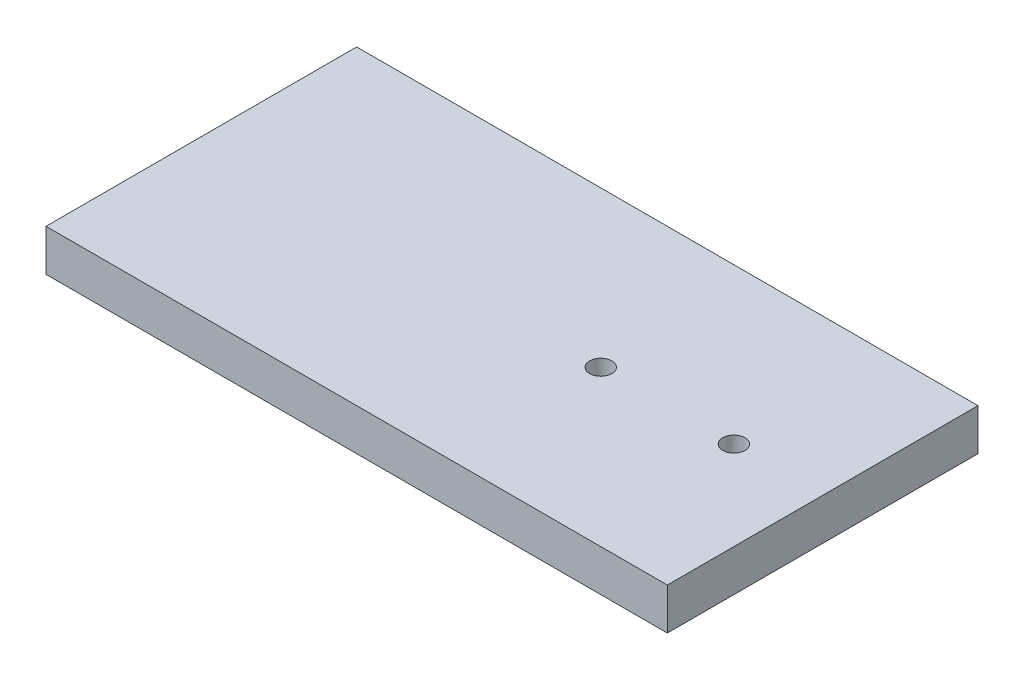
ISO-10303-21;
HEADER;
FILE_DESCRIPTION(('STEP AP214'),'2;1');
FILE_NAME('part.step','',(''),(''),'','','');
FILE_SCHEMA(('AUTOMOTIVE_DESIGN { 1 0 10303 214 1 1 1 1 }'));
ENDSEC;
DATA;
#1=APPLICATION_CONTEXT('core data for automotive mechanical design processes');
#2=APPLICATION_PROTOCOL_DEFINITION('international standard','automotive_design',2000,#1);
#3=PRODUCT_CONTEXT('',#1,'mechanical');
#4=PRODUCT('Part','Part','',(#3));
#5=PRODUCT_RELATED_PRODUCT_CATEGORY('part','',(#4));
#6=PRODUCT_DEFINITION_FORMATION('','',#4);
#7=PRODUCT_DEFINITION_CONTEXT('part definition',#1,'design');
#8=PRODUCT_DEFINITION('design','',#6,#7);
#9=PRODUCT_DEFINITION_SHAPE('','',#8);
#10=(LENGTH_UNIT() NAMED_UNIT(*) SI_UNIT(.MILLI.,.METRE.));
#11=(NAMED_UNIT(*) PLANE_ANGLE_UNIT() SI_UNIT($,.RADIAN.));
#12=(NAMED_UNIT(*) SI_UNIT($,.STERADIAN.) SOLID_ANGLE_UNIT());
#13=UNCERTAINTY_MEASURE_WITH_UNIT(LENGTH_MEASURE(1.E-05),#10,'distance_accuracy_value','');
#14=(GEOMETRIC_REPRESENTATION_CONTEXT(3) GLOBAL_UNCERTAINTY_ASSIGNED_CONTEXT((#13)) GLOBAL_UNIT_ASSIGNED_CONTEXT((#10,
#11,#12)) REPRESENTATION_CONTEXT('',''));
#15=CARTESIAN_POINT('',(0.,0.,0.));
#16=DIRECTION('',(0.,0.,1.));
#17=DIRECTION('',(1.,0.,0.));
#18=AXIS2_PLACEMENT_3D('',#15,#16,#17);
#19=CARTESIAN_POINT('',(-88.9,11.90625,-44.45));
#20=DIRECTION('',(1.,0.,0.));
#21=DIRECTION('',(0.,0.,-1.));
#22=AXIS2_PLACEMENT_3D('',#19,#20,#21);
#23=PLANE('',#22);
#24=DIRECTION('',(0.,0.,1.));
#25=VECTOR('',#24,1.);
#26=CARTESIAN_POINT('',(-88.9,0.,-44.45));
#27=LINE('',#26,#25);
#28=CARTESIAN_POINT('',(-88.9,0.,-44.45));
#29=VERTEX_POINT('',#28);
#30=CARTESIAN_POINT('',(-88.9,0.,44.45));
#31=VERTEX_POINT('',#30);
#32=EDGE_CURVE('E95',#29,#31,#27,.T.);
#33=ORIENTED_EDGE('',*,*,#32,.T.);
#34=DIRECTION('',(0.,-1.,0.));
#35=VECTOR('',#34,1.);
#36=CARTESIAN_POINT('',(-88.9,11.90625,44.45));
#37=LINE('',#36,#35);
#38=CARTESIAN_POINT('',(-88.9,11.90625,44.45));
#39=VERTEX_POINT('',#38);
#40=EDGE_CURVE('E11',#39,#31,#37,.T.);
#41=ORIENTED_EDGE('',*,*,#40,.F.);
#42=DIRECTION('',(0.,0.,1.));
#43=VECTOR('',#42,1.);
#44=CARTESIAN_POINT('',(-88.9,11.90625,-44.45));
#45=LINE('',#44,#43);
#46=CARTESIAN_POINT('',(-88.9,11.90625,-44.45));
#47=VERTEX_POINT('',#46);
#48=EDGE_CURVE('E83',#47,#39,#45,.T.);
#49=ORIENTED_EDGE('',*,*,#48,.F.);
#50=DIRECTION('',(0.,-1.,0.));
#51=VECTOR('',#50,1.);
#52=CARTESIAN_POINT('',(-88.9,11.90625,-44.45));
#53=LINE('',#52,#51);
#54=EDGE_CURVE('E91',#47,#29,#53,.T.);
#55=ORIENTED_EDGE('',*,*,#54,.T.);
#56=EDGE_LOOP('',(#33,#41,#49,#55));
#57=FACE_BOUND('',#56,.T.);
#58=ADVANCED_FACE('F32',(#57),#23,.F.);
#59=CARTESIAN_POINT('',(88.9,11.90625,44.45));
#60=DIRECTION('',(0.,0.,-1.));
#61=DIRECTION('',(-1.,0.,0.));
#62=AXIS2_PLACEMENT_3D('',#59,#60,#61);
#63=PLANE('',#62);
#64=DIRECTION('',(1.,0.,0.));
#65=VECTOR('',#64,1.);
#66=CARTESIAN_POINT('',(88.9,0.,44.45));
#67=LINE('',#66,#65);
#68=CARTESIAN_POINT('',(88.9,0.,44.45));
#69=VERTEX_POINT('',#68);
#70=EDGE_CURVE('E87',#31,#69,#67,.T.);
#71=ORIENTED_EDGE('',*,*,#70,.T.);
#72=DIRECTION('',(0.,-1.,0.));
#73=VECTOR('',#72,1.);
#74=CARTESIAN_POINT('',(88.9,11.90625,44.45));
#75=LINE('',#74,#73);
#76=CARTESIAN_POINT('',(88.9,11.90625,44.45));
#77=VERTEX_POINT('',#76);
#78=EDGE_CURVE('E40',#77,#69,#75,.T.);
#79=ORIENTED_EDGE('',*,*,#78,.F.);
#80=DIRECTION('',(1.,0.,0.));
#81=VECTOR('',#80,1.);
#82=CARTESIAN_POINT('',(88.9,11.90625,44.45));
#83=LINE('',#82,#81);
#84=EDGE_CURVE('E78',#39,#77,#83,.T.);
#85=ORIENTED_EDGE('',*,*,#84,.F.);
#86=ORIENTED_EDGE('',*,*,#40,.T.);
#87=EDGE_LOOP('',(#71,#79,#85,#86));
#88=FACE_BOUND('',#87,.T.);
#89=ADVANCED_FACE('F86',(#88),#63,.F.);
#90=CARTESIAN_POINT('',(88.9,11.90625,-44.45));
#91=DIRECTION('',(-1.,0.,0.));
#92=DIRECTION('',(0.,0.,1.));
#93=AXIS2_PLACEMENT_3D('',#90,#91,#92);
#94=PLANE('',#93);
#95=DIRECTION('',(0.,0.,-1.));
#96=VECTOR('',#95,1.);
#97=CARTESIAN_POINT('',(88.9,0.,-44.45));
#98=LINE('',#97,#96);
#99=CARTESIAN_POINT('',(88.9,0.,-44.45));
#100=VERTEX_POINT('',#99);
#101=EDGE_CURVE('E65',#69,#100,#98,.T.);
#102=ORIENTED_EDGE('',*,*,#101,.T.);
#103=DIRECTION('',(0.,-1.,0.));
#104=VECTOR('',#103,1.);
#105=CARTESIAN_POINT('',(88.9,11.90625,-44.45));
#106=LINE('',#105,#104);
#107=CARTESIAN_POINT('',(88.9,11.90625,-44.45));
#108=VERTEX_POINT('',#107);
#109=EDGE_CURVE('E88',#108,#100,#106,.T.);
#110=ORIENTED_EDGE('',*,*,#109,.F.);
#111=DIRECTION('',(0.,0.,-1.));
#112=VECTOR('',#111,1.);
#113=CARTESIAN_POINT('',(88.9,11.90625,-44.45));
#114=LINE('',#113,#112);
#115=EDGE_CURVE('E81',#77,#108,#114,.T.);
#116=ORIENTED_EDGE('',*,*,#115,.F.);
#117=ORIENTED_EDGE('',*,*,#78,.T.);
#118=EDGE_LOOP('',(#102,#110,#116,#117));
#119=FACE_BOUND('',#118,.T.);
#120=ADVANCED_FACE('F89',(#119),#94,.F.);
#121=CARTESIAN_POINT('',(88.9,11.90625,-44.45));
#122=DIRECTION('',(0.,0.,1.));
#123=DIRECTION('',(1.,0.,0.));
#124=AXIS2_PLACEMENT_3D('',#121,#122,#123);
#125=PLANE('',#124);
#126=DIRECTION('',(-1.,0.,0.));
#127=VECTOR('',#126,1.);
#128=CARTESIAN_POINT('',(88.9,0.,-44.45));
#129=LINE('',#128,#127);
#130=EDGE_CURVE('E71',#100,#29,#129,.T.);
#131=ORIENTED_EDGE('',*,*,#130,.T.);
#132=ORIENTED_EDGE('',*,*,#54,.F.);
#133=DIRECTION('',(-1.,0.,0.));
#134=VECTOR('',#133,1.);
#135=CARTESIAN_POINT('',(88.9,11.90625,-44.45));
#136=LINE('',#135,#134);
#137=EDGE_CURVE('E48',#108,#47,#136,.T.);
#138=ORIENTED_EDGE('',*,*,#137,.F.);
#139=ORIENTED_EDGE('',*,*,#109,.T.);
#140=EDGE_LOOP('',(#131,#132,#138,#139));
#141=FACE_BOUND('',#140,.T.);
#142=ADVANCED_FACE('F103',(#141),#125,.F.);
#143=CARTESIAN_POINT('',(0.,11.90625,0.));
#144=DIRECTION('',(0.,-1.,0.));
#145=DIRECTION('',(0.,0.,-1.));
#146=AXIS2_PLACEMENT_3D('',#143,#144,#145);
#147=PLANE('',#146);
#148=CARTESIAN_POINT('',(63.5,11.90625,0.));
#149=DIRECTION('',(0.,-1.,0.));
#150=DIRECTION('',(0.,0.,-1.));
#151=AXIS2_PLACEMENT_3D('',#148,#149,#150);
#152=CIRCLE('',#151,3.175);
#153=CARTESIAN_POINT('',(63.5,11.90625,-3.175));
#154=VERTEX_POINT('',#153);
#155=EDGE_CURVE('E114',#154,#154,#152,.T.);
#156=ORIENTED_EDGE('',*,*,#155,.T.);
#157=EDGE_LOOP('',(#156));
#158=FACE_BOUND('',#157,.T.);
#159=CARTESIAN_POINT('',(25.4,11.90625,0.));
#160=DIRECTION('',(0.,-1.,0.));
#161=DIRECTION('',(0.,0.,-1.));
#162=AXIS2_PLACEMENT_3D('',#159,#160,#161);
#163=CIRCLE('',#162,3.17499999999999);
#164=CARTESIAN_POINT('',(25.4,11.90625,-3.17499999999999));
#165=VERTEX_POINT('',#164);
#166=EDGE_CURVE('E98',#165,#165,#163,.T.);
#167=ORIENTED_EDGE('',*,*,#166,.T.);
#168=EDGE_LOOP('',(#167));
#169=FACE_BOUND('',#168,.T.);
#170=ORIENTED_EDGE('',*,*,#48,.T.);
#171=ORIENTED_EDGE('',*,*,#84,.T.);
#172=ORIENTED_EDGE('',*,*,#115,.T.);
#173=ORIENTED_EDGE('',*,*,#137,.T.);
#174=EDGE_LOOP('',(#170,#171,#172,#173));
#175=FACE_BOUND('',#174,.T.);
#176=ADVANCED_FACE('F79',(#158,#169,#175),#147,.F.);
#177=CARTESIAN_POINT('',(0.,0.,0.));
#178=DIRECTION('',(0.,-1.,0.));
#179=DIRECTION('',(0.,0.,-1.));
#180=AXIS2_PLACEMENT_3D('',#177,#178,#179);
#181=PLANE('',#180);
#182=CARTESIAN_POINT('',(63.5,0.,0.));
#183=DIRECTION('',(0.,-1.,0.));
#184=DIRECTION('',(0.,0.,-1.));
#185=AXIS2_PLACEMENT_3D('',#182,#183,#184);
#186=CIRCLE('',#185,3.17499999999998);
#187=CARTESIAN_POINT('',(63.5,0.,-3.17499999999998));
#188=VERTEX_POINT('',#187);
#189=EDGE_CURVE('E117',#188,#188,#186,.T.);
#190=ORIENTED_EDGE('',*,*,#189,.F.);
#191=EDGE_LOOP('',(#190));
#192=FACE_BOUND('',#191,.T.);
#193=CARTESIAN_POINT('',(25.4,0.,0.));
#194=DIRECTION('',(0.,-1.,0.));
#195=DIRECTION('',(0.,0.,-1.));
#196=AXIS2_PLACEMENT_3D('',#193,#194,#195);
#197=CIRCLE('',#196,3.17499999999999);
#198=CARTESIAN_POINT('',(25.4,0.,-3.17499999999999));
#199=VERTEX_POINT('',#198);
#200=EDGE_CURVE('E111',#199,#199,#197,.T.);
#201=ORIENTED_EDGE('',*,*,#200,.F.);
#202=EDGE_LOOP('',(#201));
#203=FACE_BOUND('',#202,.T.);
#204=ORIENTED_EDGE('',*,*,#32,.F.);
#205=ORIENTED_EDGE('',*,*,#130,.F.);
#206=ORIENTED_EDGE('',*,*,#101,.F.);
#207=ORIENTED_EDGE('',*,*,#70,.F.);
#208=EDGE_LOOP('',(#204,#205,#206,#207));
#209=FACE_BOUND('',#208,.T.);
#210=ADVANCED_FACE('F106',(#192,#203,#209),#181,.T.);
#211=CARTESIAN_POINT('',(25.4,0.,0.));
#212=DIRECTION('',(0.,-1.,0.));
#213=DIRECTION('',(0.,0.,-1.));
#214=AXIS2_PLACEMENT_3D('',#211,#212,#213);
#215=CYLINDRICAL_SURFACE('',#214,3.17499999999999);
#216=ORIENTED_EDGE('',*,*,#166,.F.);
#217=EDGE_LOOP('',(#216));
#218=FACE_BOUND('',#217,.T.);
#219=ORIENTED_EDGE('',*,*,#200,.T.);
#220=EDGE_LOOP('',(#219));
#221=FACE_BOUND('',#220,.T.);
#222=ADVANCED_FACE('F125',(#218,#221),#215,.F.);
#223=CARTESIAN_POINT('',(63.5,0.,0.));
#224=DIRECTION('',(0.,-1.,0.));
#225=DIRECTION('',(0.,0.,-1.));
#226=AXIS2_PLACEMENT_3D('',#223,#224,#225);
#227=CYLINDRICAL_SURFACE('',#226,3.17499999999999);
#228=ORIENTED_EDGE('',*,*,#155,.F.);
#229=EDGE_LOOP('',(#228));
#230=FACE_BOUND('',#229,.T.);
#231=ORIENTED_EDGE('',*,*,#189,.T.);
#232=EDGE_LOOP('',(#231));
#233=FACE_BOUND('',#232,.T.);
#234=ADVANCED_FACE('F121',(#230,#233),#227,.F.);
#235=CLOSED_SHELL('',(#58,#89,#120,#142,#176,#210,#222,#234));
#236=MANIFOLD_SOLID_BREP('B2',#235);
#237=ADVANCED_BREP_SHAPE_REPRESENTATION('',(#18,#236),#14);
#238=SHAPE_DEFINITION_REPRESENTATION(#9,#237);
ENDSEC;
END-ISO-10303-21;
